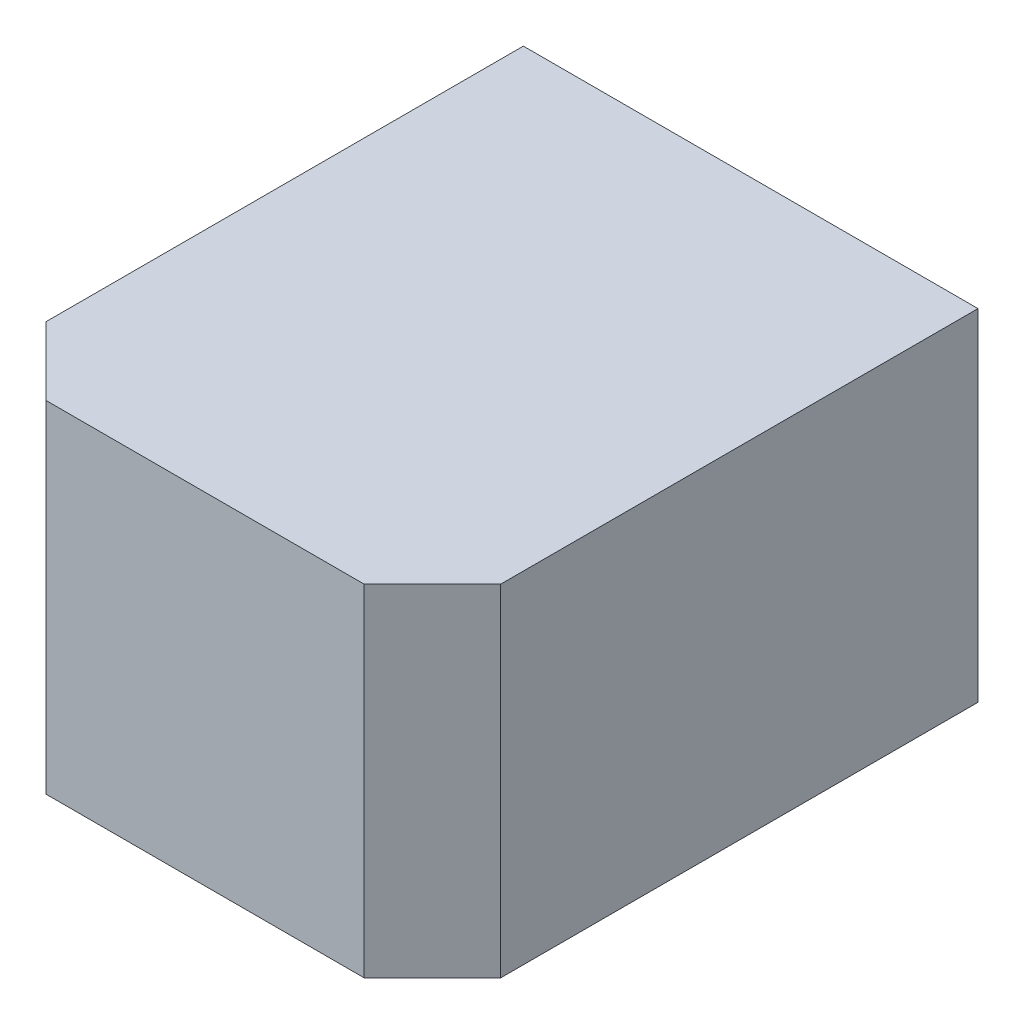
ISO-10303-21;
HEADER;
FILE_DESCRIPTION(('STEP AP214'),'2;1');
FILE_NAME('part.step','',(''),(''),'','','');
FILE_SCHEMA(('AUTOMOTIVE_DESIGN { 1 0 10303 214 1 1 1 1 }'));
ENDSEC;
DATA;
#1=APPLICATION_CONTEXT('core data for automotive mechanical design processes');
#2=APPLICATION_PROTOCOL_DEFINITION('international standard','automotive_design',2000,#1);
#3=PRODUCT_CONTEXT('',#1,'mechanical');
#4=PRODUCT('Part','Part','',(#3));
#5=PRODUCT_RELATED_PRODUCT_CATEGORY('part','',(#4));
#6=PRODUCT_DEFINITION_FORMATION('','',#4);
#7=PRODUCT_DEFINITION_CONTEXT('part definition',#1,'design');
#8=PRODUCT_DEFINITION('design','',#6,#7);
#9=PRODUCT_DEFINITION_SHAPE('','',#8);
#10=(LENGTH_UNIT() NAMED_UNIT(*) SI_UNIT(.MILLI.,.METRE.));
#11=(NAMED_UNIT(*) PLANE_ANGLE_UNIT() SI_UNIT($,.RADIAN.));
#12=(NAMED_UNIT(*) SI_UNIT($,.STERADIAN.) SOLID_ANGLE_UNIT());
#13=UNCERTAINTY_MEASURE_WITH_UNIT(LENGTH_MEASURE(1.E-05),#10,'distance_accuracy_value','');
#14=(GEOMETRIC_REPRESENTATION_CONTEXT(3) GLOBAL_UNCERTAINTY_ASSIGNED_CONTEXT((#13)) GLOBAL_UNIT_ASSIGNED_CONTEXT((#10,
#11,#12)) REPRESENTATION_CONTEXT('',''));
#15=CARTESIAN_POINT('',(0.,0.,0.));
#16=DIRECTION('',(0.,0.,1.));
#17=DIRECTION('',(1.,0.,0.));
#18=AXIS2_PLACEMENT_3D('',#15,#16,#17);
#19=CARTESIAN_POINT('',(0.,0.,0.));
#20=DIRECTION('',(0.,0.,1.));
#21=DIRECTION('',(1.,0.,0.));
#22=AXIS2_PLACEMENT_3D('',#19,#20,#21);
#23=PLANE('',#22);
#24=DIRECTION('',(0.,1.,0.));
#25=VECTOR('',#24,1.);
#26=CARTESIAN_POINT('',(10.,7.5,0.));
#27=LINE('',#26,#25);
#28=CARTESIAN_POINT('',(10.,-7.5,0.));
#29=VERTEX_POINT('',#28);
#30=CARTESIAN_POINT('',(10.,7.5,0.));
#31=VERTEX_POINT('',#30);
#32=EDGE_CURVE('E128',#29,#31,#27,.T.);
#33=ORIENTED_EDGE('',*,*,#32,.F.);
#34=DIRECTION('',(1.,0.,0.));
#35=VECTOR('',#34,1.);
#36=CARTESIAN_POINT('',(-10.,-7.5,0.));
#37=LINE('',#36,#35);
#38=CARTESIAN_POINT('',(-10.,-7.5,0.));
#39=VERTEX_POINT('',#38);
#40=EDGE_CURVE('E134',#39,#29,#37,.T.);
#41=ORIENTED_EDGE('',*,*,#40,.F.);
#42=DIRECTION('',(0.,-1.,0.));
#43=VECTOR('',#42,1.);
#44=CARTESIAN_POINT('',(-10.,7.5,0.));
#45=LINE('',#44,#43);
#46=CARTESIAN_POINT('',(-10.,7.5,0.));
#47=VERTEX_POINT('',#46);
#48=EDGE_CURVE('E142',#47,#39,#45,.T.);
#49=ORIENTED_EDGE('',*,*,#48,.F.);
#50=DIRECTION('',(-1.,0.,0.));
#51=VECTOR('',#50,1.);
#52=CARTESIAN_POINT('',(-10.,7.5,0.));
#53=LINE('',#52,#51);
#54=EDGE_CURVE('E139',#31,#47,#53,.T.);
#55=ORIENTED_EDGE('',*,*,#54,.F.);
#56=EDGE_LOOP('',(#33,#41,#49,#55));
#57=FACE_BOUND('',#56,.T.);
#58=DIRECTION('',(0.,-1.,0.));
#59=VECTOR('',#58,1.);
#60=CARTESIAN_POINT('',(-3.1224989991992,0.,0.));
#61=LINE('',#60,#59);
#62=CARTESIAN_POINT('',(-3.1224989991992,2.5,0.));
#63=VERTEX_POINT('',#62);
#64=CARTESIAN_POINT('',(-3.1224989991992,-2.5,0.));
#65=VERTEX_POINT('',#64);
#66=EDGE_CURVE('E60',#63,#65,#61,.T.);
#67=ORIENTED_EDGE('',*,*,#66,.T.);
#68=CARTESIAN_POINT('',(0.,0.,0.));
#69=DIRECTION('',(0.,0.,-1.));
#70=DIRECTION('',(-1.,0.,0.));
#71=AXIS2_PLACEMENT_3D('',#68,#69,#70);
#72=CIRCLE('',#71,4.);
#73=EDGE_CURVE('E121',#63,#65,#72,.T.);
#74=ORIENTED_EDGE('',*,*,#73,.F.);
#75=EDGE_LOOP('',(#67,#74));
#76=FACE_BOUND('',#75,.T.);
#77=ADVANCED_FACE('F44',(#57,#76),#23,.F.);
#78=CARTESIAN_POINT('',(10.,7.5,24.));
#79=DIRECTION('',(-1.,0.,0.));
#80=DIRECTION('',(0.,-1.,0.));
#81=AXIS2_PLACEMENT_3D('',#78,#79,#80);
#82=PLANE('',#81);
#83=DIRECTION('',(0.,0.,-1.));
#84=VECTOR('',#83,1.);
#85=CARTESIAN_POINT('',(10.,7.5,24.));
#86=LINE('',#85,#84);
#87=CARTESIAN_POINT('',(10.,7.5,21.));
#88=VERTEX_POINT('',#87);
#89=EDGE_CURVE('E152',#88,#31,#86,.T.);
#90=ORIENTED_EDGE('',*,*,#89,.F.);
#91=DIRECTION('',(0.,-1.,0.));
#92=VECTOR('',#91,1.);
#93=CARTESIAN_POINT('',(10.,-7.5,21.));
#94=LINE('',#93,#92);
#95=CARTESIAN_POINT('',(10.,-7.5,21.));
#96=VERTEX_POINT('',#95);
#97=EDGE_CURVE('E159',#88,#96,#94,.T.);
#98=ORIENTED_EDGE('',*,*,#97,.T.);
#99=DIRECTION('',(0.,0.,-1.));
#100=VECTOR('',#99,1.);
#101=CARTESIAN_POINT('',(10.,-7.5,24.));
#102=LINE('',#101,#100);
#103=EDGE_CURVE('E136',#96,#29,#102,.T.);
#104=ORIENTED_EDGE('',*,*,#103,.T.);
#105=ORIENTED_EDGE('',*,*,#32,.T.);
#106=EDGE_LOOP('',(#90,#98,#104,#105));
#107=FACE_BOUND('',#106,.T.);
#108=ADVANCED_FACE('F190',(#107),#82,.F.);
#109=CARTESIAN_POINT('',(-10.,7.5,24.));
#110=DIRECTION('',(0.,-1.,0.));
#111=DIRECTION('',(0.,0.,-1.));
#112=AXIS2_PLACEMENT_3D('',#109,#110,#111);
#113=PLANE('',#112);
#114=DIRECTION('',(0.,0.,-1.));
#115=VECTOR('',#114,1.);
#116=CARTESIAN_POINT('',(-10.,7.5,24.));
#117=LINE('',#116,#115);
#118=CARTESIAN_POINT('',(-10.,7.5,21.));
#119=VERTEX_POINT('',#118);
#120=EDGE_CURVE('E150',#119,#47,#117,.T.);
#121=ORIENTED_EDGE('',*,*,#120,.F.);
#122=DIRECTION('',(0.707106781186546,0.,0.707106781186549));
#123=VECTOR('',#122,1.);
#124=CARTESIAN_POINT('',(-7.,7.5,24.));
#125=LINE('',#124,#123);
#126=CARTESIAN_POINT('',(-7.,7.5,24.));
#127=VERTEX_POINT('',#126);
#128=EDGE_CURVE('E11',#119,#127,#125,.T.);
#129=ORIENTED_EDGE('',*,*,#128,.T.);
#130=DIRECTION('',(-1.,0.,0.));
#131=VECTOR('',#130,1.);
#132=CARTESIAN_POINT('',(-10.,7.5,24.));
#133=LINE('',#132,#131);
#134=CARTESIAN_POINT('',(7.,7.5,24.));
#135=VERTEX_POINT('',#134);
#136=EDGE_CURVE('E130',#135,#127,#133,.T.);
#137=ORIENTED_EDGE('',*,*,#136,.F.);
#138=DIRECTION('',(0.707106781186546,0.,-0.707106781186549));
#139=VECTOR('',#138,1.);
#140=CARTESIAN_POINT('',(7.,7.5,24.));
#141=LINE('',#140,#139);
#142=EDGE_CURVE('E157',#135,#88,#141,.T.);
#143=ORIENTED_EDGE('',*,*,#142,.T.);
#144=ORIENTED_EDGE('',*,*,#89,.T.);
#145=ORIENTED_EDGE('',*,*,#54,.T.);
#146=EDGE_LOOP('',(#121,#129,#137,#143,#144,#145));
#147=FACE_BOUND('',#146,.T.);
#148=ADVANCED_FACE('F179',(#147),#113,.F.);
#149=CARTESIAN_POINT('',(-10.,7.5,24.));
#150=DIRECTION('',(1.,0.,0.));
#151=DIRECTION('',(0.,1.,0.));
#152=AXIS2_PLACEMENT_3D('',#149,#150,#151);
#153=PLANE('',#152);
#154=DIRECTION('',(0.,0.,-1.));
#155=VECTOR('',#154,1.);
#156=CARTESIAN_POINT('',(-10.,-7.5,24.));
#157=LINE('',#156,#155);
#158=CARTESIAN_POINT('',(-10.,-7.5,21.));
#159=VERTEX_POINT('',#158);
#160=EDGE_CURVE('E148',#159,#39,#157,.T.);
#161=ORIENTED_EDGE('',*,*,#160,.F.);
#162=DIRECTION('',(0.,1.,0.));
#163=VECTOR('',#162,1.);
#164=CARTESIAN_POINT('',(-10.,7.5,21.));
#165=LINE('',#164,#163);
#166=EDGE_CURVE('E53',#159,#119,#165,.T.);
#167=ORIENTED_EDGE('',*,*,#166,.T.);
#168=ORIENTED_EDGE('',*,*,#120,.T.);
#169=ORIENTED_EDGE('',*,*,#48,.T.);
#170=EDGE_LOOP('',(#161,#167,#168,#169));
#171=FACE_BOUND('',#170,.T.);
#172=ADVANCED_FACE('F173',(#171),#153,.F.);
#173=CARTESIAN_POINT('',(-10.,-7.5,24.));
#174=DIRECTION('',(0.,1.,0.));
#175=DIRECTION('',(0.,0.,1.));
#176=AXIS2_PLACEMENT_3D('',#173,#174,#175);
#177=PLANE('',#176);
#178=DIRECTION('',(1.,0.,0.));
#179=VECTOR('',#178,1.);
#180=CARTESIAN_POINT('',(-10.,-7.5,24.));
#181=LINE('',#180,#179);
#182=CARTESIAN_POINT('',(-7.,-7.5,24.));
#183=VERTEX_POINT('',#182);
#184=CARTESIAN_POINT('',(7.,-7.5,24.));
#185=VERTEX_POINT('',#184);
#186=EDGE_CURVE('E133',#183,#185,#181,.T.);
#187=ORIENTED_EDGE('',*,*,#186,.F.);
#188=DIRECTION('',(-0.707106781186546,0.,-0.707106781186549));
#189=VECTOR('',#188,1.);
#190=CARTESIAN_POINT('',(-7.,-7.5,24.));
#191=LINE('',#190,#189);
#192=EDGE_CURVE('E167',#183,#159,#191,.T.);
#193=ORIENTED_EDGE('',*,*,#192,.T.);
#194=ORIENTED_EDGE('',*,*,#160,.T.);
#195=ORIENTED_EDGE('',*,*,#40,.T.);
#196=ORIENTED_EDGE('',*,*,#103,.F.);
#197=DIRECTION('',(-0.707106781186546,0.,0.707106781186549));
#198=VECTOR('',#197,1.);
#199=CARTESIAN_POINT('',(7.,-7.5,24.));
#200=LINE('',#199,#198);
#201=EDGE_CURVE('E161',#96,#185,#200,.T.);
#202=ORIENTED_EDGE('',*,*,#201,.T.);
#203=EDGE_LOOP('',(#187,#193,#194,#195,#196,#202));
#204=FACE_BOUND('',#203,.T.);
#205=ADVANCED_FACE('F170',(#204),#177,.F.);
#206=CARTESIAN_POINT('',(0.,0.,24.));
#207=DIRECTION('',(0.,0.,1.));
#208=DIRECTION('',(1.,0.,0.));
#209=AXIS2_PLACEMENT_3D('',#206,#207,#208);
#210=PLANE('',#209);
#211=ORIENTED_EDGE('',*,*,#136,.T.);
#212=DIRECTION('',(0.,-1.,0.));
#213=VECTOR('',#212,1.);
#214=CARTESIAN_POINT('',(-7.,-7.5,24.));
#215=LINE('',#214,#213);
#216=EDGE_CURVE('E164',#127,#183,#215,.T.);
#217=ORIENTED_EDGE('',*,*,#216,.T.);
#218=ORIENTED_EDGE('',*,*,#186,.T.);
#219=DIRECTION('',(0.,1.,0.));
#220=VECTOR('',#219,1.);
#221=CARTESIAN_POINT('',(7.,7.5,24.));
#222=LINE('',#221,#220);
#223=EDGE_CURVE('E154',#185,#135,#222,.T.);
#224=ORIENTED_EDGE('',*,*,#223,.T.);
#225=EDGE_LOOP('',(#211,#217,#218,#224));
#226=FACE_BOUND('',#225,.T.);
#227=ADVANCED_FACE('F181',(#226),#210,.T.);
#228=CARTESIAN_POINT('',(7.,0.,24.));
#229=DIRECTION('',(0.707106781186549,0.,0.707106781186546));
#230=DIRECTION('',(0.,-1.,0.));
#231=AXIS2_PLACEMENT_3D('',#228,#229,#230);
#232=PLANE('',#231);
#233=ORIENTED_EDGE('',*,*,#201,.F.);
#234=ORIENTED_EDGE('',*,*,#97,.F.);
#235=ORIENTED_EDGE('',*,*,#142,.F.);
#236=ORIENTED_EDGE('',*,*,#223,.F.);
#237=EDGE_LOOP('',(#233,#234,#235,#236));
#238=FACE_BOUND('',#237,.T.);
#239=ADVANCED_FACE('F185',(#238),#232,.T.);
#240=CARTESIAN_POINT('',(-7.,0.,24.));
#241=DIRECTION('',(-0.707106781186549,0.,0.707106781186546));
#242=DIRECTION('',(0.,1.,0.));
#243=AXIS2_PLACEMENT_3D('',#240,#241,#242);
#244=PLANE('',#243);
#245=ORIENTED_EDGE('',*,*,#128,.F.);
#246=ORIENTED_EDGE('',*,*,#166,.F.);
#247=ORIENTED_EDGE('',*,*,#192,.F.);
#248=ORIENTED_EDGE('',*,*,#216,.F.);
#249=EDGE_LOOP('',(#245,#246,#247,#248));
#250=FACE_BOUND('',#249,.T.);
#251=ADVANCED_FACE('F47',(#250),#244,.T.);
#252=CARTESIAN_POINT('',(-3.1224989991992,0.,10.));
#253=DIRECTION('',(1.,0.,0.));
#254=DIRECTION('',(0.,0.,-1.));
#255=AXIS2_PLACEMENT_3D('',#252,#253,#254);
#256=PLANE('',#255);
#257=ORIENTED_EDGE('',*,*,#66,.F.);
#258=DIRECTION('',(0.,0.,-1.));
#259=VECTOR('',#258,1.);
#260=CARTESIAN_POINT('',(-3.1224989991992,2.5,10.));
#261=LINE('',#260,#259);
#262=CARTESIAN_POINT('',(-3.1224989991992,2.5,10.));
#263=VERTEX_POINT('',#262);
#264=EDGE_CURVE('E106',#263,#63,#261,.T.);
#265=ORIENTED_EDGE('',*,*,#264,.F.);
#266=DIRECTION('',(0.,-1.,0.));
#267=VECTOR('',#266,1.);
#268=CARTESIAN_POINT('',(-3.1224989991992,0.,10.));
#269=LINE('',#268,#267);
#270=CARTESIAN_POINT('',(-3.1224989991992,-2.5,10.));
#271=VERTEX_POINT('',#270);
#272=EDGE_CURVE('E109',#263,#271,#269,.T.);
#273=ORIENTED_EDGE('',*,*,#272,.T.);
#274=DIRECTION('',(0.,0.,-1.));
#275=VECTOR('',#274,1.);
#276=CARTESIAN_POINT('',(-3.1224989991992,-2.5,10.));
#277=LINE('',#276,#275);
#278=EDGE_CURVE('E115',#271,#65,#277,.T.);
#279=ORIENTED_EDGE('',*,*,#278,.T.);
#280=EDGE_LOOP('',(#257,#265,#273,#279));
#281=FACE_BOUND('',#280,.T.);
#282=ADVANCED_FACE('F108',(#281),#256,.T.);
#283=CARTESIAN_POINT('',(0.,0.,10.));
#284=DIRECTION('',(0.,0.,-1.));
#285=DIRECTION('',(-1.,0.,0.));
#286=AXIS2_PLACEMENT_3D('',#283,#284,#285);
#287=CYLINDRICAL_SURFACE('',#286,4.);
#288=ORIENTED_EDGE('',*,*,#73,.T.);
#289=ORIENTED_EDGE('',*,*,#278,.F.);
#290=CARTESIAN_POINT('',(0.,0.,10.));
#291=DIRECTION('',(0.,0.,-1.));
#292=DIRECTION('',(-1.,0.,0.));
#293=AXIS2_PLACEMENT_3D('',#290,#291,#292);
#294=CIRCLE('',#293,4.);
#295=EDGE_CURVE('E116',#263,#271,#294,.T.);
#296=ORIENTED_EDGE('',*,*,#295,.F.);
#297=ORIENTED_EDGE('',*,*,#264,.T.);
#298=EDGE_LOOP('',(#288,#289,#296,#297));
#299=FACE_BOUND('',#298,.T.);
#300=ADVANCED_FACE('F123',(#299),#287,.F.);
#301=CARTESIAN_POINT('',(0.,0.,10.));
#302=DIRECTION('',(0.,0.,-1.));
#303=DIRECTION('',(-1.,0.,0.));
#304=AXIS2_PLACEMENT_3D('',#301,#302,#303);
#305=PLANE('',#304);
#306=ORIENTED_EDGE('',*,*,#272,.F.);
#307=ORIENTED_EDGE('',*,*,#295,.T.);
#308=EDGE_LOOP('',(#306,#307));
#309=FACE_BOUND('',#308,.T.);
#310=ADVANCED_FACE('F120',(#309),#305,.T.);
#311=CLOSED_SHELL('',(#77,#108,#148,#172,#205,#227,#239,#251,#282,#300,#310));
#312=MANIFOLD_SOLID_BREP('B2',#311);
#313=ADVANCED_BREP_SHAPE_REPRESENTATION('',(#18,#312),#14);
#314=SHAPE_DEFINITION_REPRESENTATION(#9,#313);
ENDSEC;
END-ISO-10303-21;
